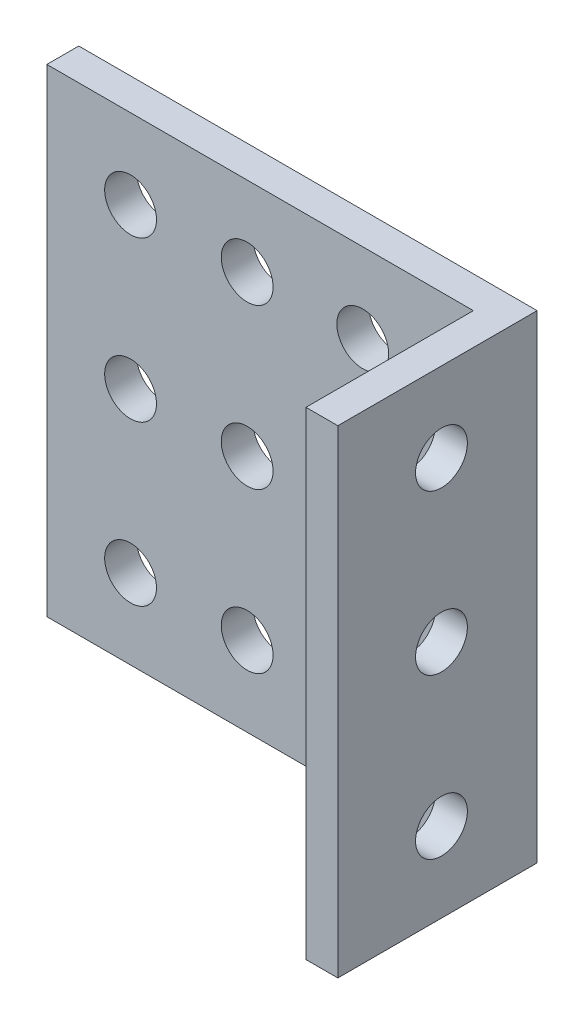
ISO-10303-21;
HEADER;
FILE_DESCRIPTION(('STEP AP214'),'2;1');
FILE_NAME('part.step','',(''),(''),'','','');
FILE_SCHEMA(('AUTOMOTIVE_DESIGN { 1 0 10303 214 1 1 1 1 }'));
ENDSEC;
DATA;
#1=APPLICATION_CONTEXT('core data for automotive mechanical design processes');
#2=APPLICATION_PROTOCOL_DEFINITION('international standard','automotive_design',2000,#1);
#3=PRODUCT_CONTEXT('',#1,'mechanical');
#4=PRODUCT('Part','Part','',(#3));
#5=PRODUCT_RELATED_PRODUCT_CATEGORY('part','',(#4));
#6=PRODUCT_DEFINITION_FORMATION('','',#4);
#7=PRODUCT_DEFINITION_CONTEXT('part definition',#1,'design');
#8=PRODUCT_DEFINITION('design','',#6,#7);
#9=PRODUCT_DEFINITION_SHAPE('','',#8);
#10=(LENGTH_UNIT() NAMED_UNIT(*) SI_UNIT(.MILLI.,.METRE.));
#11=(NAMED_UNIT(*) PLANE_ANGLE_UNIT() SI_UNIT($,.RADIAN.));
#12=(NAMED_UNIT(*) SI_UNIT($,.STERADIAN.) SOLID_ANGLE_UNIT());
#13=UNCERTAINTY_MEASURE_WITH_UNIT(LENGTH_MEASURE(1.E-05),#10,'distance_accuracy_value','');
#14=(GEOMETRIC_REPRESENTATION_CONTEXT(3) GLOBAL_UNCERTAINTY_ASSIGNED_CONTEXT((#13)) GLOBAL_UNIT_ASSIGNED_CONTEXT((#10,
#11,#12)) REPRESENTATION_CONTEXT('',''));
#15=CARTESIAN_POINT('',(0.,0.,0.));
#16=DIRECTION('',(0.,0.,1.));
#17=DIRECTION('',(1.,0.,0.));
#18=AXIS2_PLACEMENT_3D('',#15,#16,#17);
#19=CARTESIAN_POINT('',(-115.,-120.,16.));
#20=DIRECTION('',(1.,0.,0.));
#21=DIRECTION('',(0.,0.,-1.));
#22=AXIS2_PLACEMENT_3D('',#19,#20,#21);
#23=PLANE('',#22);
#24=DIRECTION('',(0.,-1.,0.));
#25=VECTOR('',#24,1.);
#26=CARTESIAN_POINT('',(-115.,-120.,0.));
#27=LINE('',#26,#25);
#28=CARTESIAN_POINT('',(-115.,120.,0.));
#29=VERTEX_POINT('',#28);
#30=CARTESIAN_POINT('',(-115.,-120.,0.));
#31=VERTEX_POINT('',#30);
#32=EDGE_CURVE('E93',#29,#31,#27,.T.);
#33=ORIENTED_EDGE('',*,*,#32,.T.);
#34=DIRECTION('',(0.,0.,-1.));
#35=VECTOR('',#34,1.);
#36=CARTESIAN_POINT('',(-115.,-120.,16.));
#37=LINE('',#36,#35);
#38=CARTESIAN_POINT('',(-115.,-120.,16.));
#39=VERTEX_POINT('',#38);
#40=EDGE_CURVE('E114',#39,#31,#37,.T.);
#41=ORIENTED_EDGE('',*,*,#40,.F.);
#42=DIRECTION('',(0.,-1.,0.));
#43=VECTOR('',#42,1.);
#44=CARTESIAN_POINT('',(-115.,-120.,16.));
#45=LINE('',#44,#43);
#46=CARTESIAN_POINT('',(-115.,120.,16.));
#47=VERTEX_POINT('',#46);
#48=EDGE_CURVE('E87',#47,#39,#45,.T.);
#49=ORIENTED_EDGE('',*,*,#48,.F.);
#50=DIRECTION('',(0.,0.,-1.));
#51=VECTOR('',#50,1.);
#52=CARTESIAN_POINT('',(-115.,120.,16.));
#53=LINE('',#52,#51);
#54=EDGE_CURVE('E79',#47,#29,#53,.T.);
#55=ORIENTED_EDGE('',*,*,#54,.T.);
#56=EDGE_LOOP('',(#33,#41,#49,#55));
#57=FACE_BOUND('',#56,.T.);
#58=ADVANCED_FACE('F36',(#57),#23,.F.);
#59=CARTESIAN_POINT('',(115.,-120.,16.));
#60=DIRECTION('',(0.,1.,0.));
#61=DIRECTION('',(-1.,0.,0.));
#62=AXIS2_PLACEMENT_3D('',#59,#60,#61);
#63=PLANE('',#62);
#64=DIRECTION('',(1.,0.,0.));
#65=VECTOR('',#64,1.);
#66=CARTESIAN_POINT('',(115.,-120.,0.));
#67=LINE('',#66,#65);
#68=CARTESIAN_POINT('',(115.,-120.,0.));
#69=VERTEX_POINT('',#68);
#70=EDGE_CURVE('E97',#31,#69,#67,.T.);
#71=ORIENTED_EDGE('',*,*,#70,.T.);
#72=DIRECTION('',(0.,0.,-1.));
#73=VECTOR('',#72,1.);
#74=CARTESIAN_POINT('',(115.,-120.,16.));
#75=LINE('',#74,#73);
#76=CARTESIAN_POINT('',(115.,-120.,100.));
#77=VERTEX_POINT('',#76);
#78=EDGE_CURVE('E111',#77,#69,#75,.T.);
#79=ORIENTED_EDGE('',*,*,#78,.F.);
#80=DIRECTION('',(1.,0.,0.));
#81=VECTOR('',#80,1.);
#82=CARTESIAN_POINT('',(115.,-120.,100.));
#83=LINE('',#82,#81);
#84=CARTESIAN_POINT('',(99.,-120.,100.));
#85=VERTEX_POINT('',#84);
#86=EDGE_CURVE('E175',#85,#77,#83,.T.);
#87=ORIENTED_EDGE('',*,*,#86,.F.);
#88=DIRECTION('',(0.,0.,-1.));
#89=VECTOR('',#88,1.);
#90=CARTESIAN_POINT('',(99.,-120.,100.));
#91=LINE('',#90,#89);
#92=CARTESIAN_POINT('',(99.,-120.,16.));
#93=VERTEX_POINT('',#92);
#94=EDGE_CURVE('E180',#85,#93,#91,.T.);
#95=ORIENTED_EDGE('',*,*,#94,.T.);
#96=DIRECTION('',(1.,0.,0.));
#97=VECTOR('',#96,1.);
#98=CARTESIAN_POINT('',(115.,-120.,16.));
#99=LINE('',#98,#97);
#100=EDGE_CURVE('E134',#39,#93,#99,.T.);
#101=ORIENTED_EDGE('',*,*,#100,.F.);
#102=ORIENTED_EDGE('',*,*,#40,.T.);
#103=EDGE_LOOP('',(#71,#79,#87,#95,#101,#102));
#104=FACE_BOUND('',#103,.T.);
#105=ADVANCED_FACE('F217',(#104),#63,.F.);
#106=CARTESIAN_POINT('',(115.,-120.,16.));
#107=DIRECTION('',(-1.,0.,0.));
#108=DIRECTION('',(0.,0.,1.));
#109=AXIS2_PLACEMENT_3D('',#106,#107,#108);
#110=PLANE('',#109);
#111=CARTESIAN_POINT('',(115.,0.,48.));
#112=DIRECTION('',(-1.,0.,0.));
#113=DIRECTION('',(0.,0.,1.));
#114=AXIS2_PLACEMENT_3D('',#111,#112,#113);
#115=CIRCLE('',#114,13.);
#116=CARTESIAN_POINT('',(115.,0.,61.));
#117=VERTEX_POINT('',#116);
#118=EDGE_CURVE('E270',#117,#117,#115,.T.);
#119=ORIENTED_EDGE('',*,*,#118,.T.);
#120=EDGE_LOOP('',(#119));
#121=FACE_BOUND('',#120,.T.);
#122=CARTESIAN_POINT('',(115.,80.,48.));
#123=DIRECTION('',(-1.,0.,0.));
#124=DIRECTION('',(0.,0.,1.));
#125=AXIS2_PLACEMENT_3D('',#122,#123,#124);
#126=CIRCLE('',#125,13.);
#127=CARTESIAN_POINT('',(115.,80.,61.));
#128=VERTEX_POINT('',#127);
#129=EDGE_CURVE('E179',#128,#128,#126,.T.);
#130=ORIENTED_EDGE('',*,*,#129,.T.);
#131=EDGE_LOOP('',(#130));
#132=FACE_BOUND('',#131,.T.);
#133=DIRECTION('',(0.,1.,0.));
#134=VECTOR('',#133,1.);
#135=CARTESIAN_POINT('',(115.,-120.,0.));
#136=LINE('',#135,#134);
#137=CARTESIAN_POINT('',(115.,120.,0.));
#138=VERTEX_POINT('',#137);
#139=EDGE_CURVE('E88',#69,#138,#136,.T.);
#140=ORIENTED_EDGE('',*,*,#139,.T.);
#141=DIRECTION('',(0.,0.,-1.));
#142=VECTOR('',#141,1.);
#143=CARTESIAN_POINT('',(115.,120.,16.));
#144=LINE('',#143,#142);
#145=CARTESIAN_POINT('',(115.,120.,100.));
#146=VERTEX_POINT('',#145);
#147=EDGE_CURVE('E83',#146,#138,#144,.T.);
#148=ORIENTED_EDGE('',*,*,#147,.F.);
#149=DIRECTION('',(0.,1.,0.));
#150=VECTOR('',#149,1.);
#151=CARTESIAN_POINT('',(115.,-120.,100.));
#152=LINE('',#151,#150);
#153=EDGE_CURVE('E178',#77,#146,#152,.T.);
#154=ORIENTED_EDGE('',*,*,#153,.F.);
#155=ORIENTED_EDGE('',*,*,#78,.T.);
#156=EDGE_LOOP('',(#140,#148,#154,#155));
#157=FACE_BOUND('',#156,.T.);
#158=CARTESIAN_POINT('',(115.,-80.,48.));
#159=DIRECTION('',(-1.,0.,0.));
#160=DIRECTION('',(0.,0.,1.));
#161=AXIS2_PLACEMENT_3D('',#158,#159,#160);
#162=CIRCLE('',#161,13.);
#163=CARTESIAN_POINT('',(115.,-80.,61.));
#164=VERTEX_POINT('',#163);
#165=EDGE_CURVE('E44',#164,#164,#162,.T.);
#166=ORIENTED_EDGE('',*,*,#165,.T.);
#167=EDGE_LOOP('',(#166));
#168=FACE_BOUND('',#167,.T.);
#169=ADVANCED_FACE('F191',(#121,#132,#157,#168),#110,.F.);
#170=CARTESIAN_POINT('',(115.,120.,16.));
#171=DIRECTION('',(0.,-1.,0.));
#172=DIRECTION('',(1.,0.,0.));
#173=AXIS2_PLACEMENT_3D('',#170,#171,#172);
#174=PLANE('',#173);
#175=DIRECTION('',(-1.,0.,0.));
#176=VECTOR('',#175,1.);
#177=CARTESIAN_POINT('',(115.,120.,0.));
#178=LINE('',#177,#176);
#179=EDGE_CURVE('E76',#138,#29,#178,.T.);
#180=ORIENTED_EDGE('',*,*,#179,.T.);
#181=ORIENTED_EDGE('',*,*,#54,.F.);
#182=DIRECTION('',(-1.,0.,0.));
#183=VECTOR('',#182,1.);
#184=CARTESIAN_POINT('',(115.,120.,16.));
#185=LINE('',#184,#183);
#186=CARTESIAN_POINT('',(99.,120.,16.));
#187=VERTEX_POINT('',#186);
#188=EDGE_CURVE('E56',#187,#47,#185,.T.);
#189=ORIENTED_EDGE('',*,*,#188,.F.);
#190=DIRECTION('',(0.,0.,-1.));
#191=VECTOR('',#190,1.);
#192=CARTESIAN_POINT('',(99.,120.,100.));
#193=LINE('',#192,#191);
#194=CARTESIAN_POINT('',(99.,120.,100.));
#195=VERTEX_POINT('',#194);
#196=EDGE_CURVE('E172',#195,#187,#193,.T.);
#197=ORIENTED_EDGE('',*,*,#196,.F.);
#198=DIRECTION('',(-1.,0.,0.));
#199=VECTOR('',#198,1.);
#200=CARTESIAN_POINT('',(115.,120.,100.));
#201=LINE('',#200,#199);
#202=EDGE_CURVE('E287',#146,#195,#201,.T.);
#203=ORIENTED_EDGE('',*,*,#202,.F.);
#204=ORIENTED_EDGE('',*,*,#147,.T.);
#205=EDGE_LOOP('',(#180,#181,#189,#197,#203,#204));
#206=FACE_BOUND('',#205,.T.);
#207=ADVANCED_FACE('F78',(#206),#174,.F.);
#208=CARTESIAN_POINT('',(-115.,120.,16.));
#209=DIRECTION('',(0.,0.,1.));
#210=DIRECTION('',(1.,0.,0.));
#211=AXIS2_PLACEMENT_3D('',#208,#209,#210);
#212=PLANE('',#211);
#213=DIRECTION('',(0.,-1.,0.));
#214=VECTOR('',#213,1.);
#215=CARTESIAN_POINT('',(99.,-120.,16.));
#216=LINE('',#215,#214);
#217=EDGE_CURVE('E51',#187,#93,#216,.T.);
#218=ORIENTED_EDGE('',*,*,#217,.F.);
#219=ORIENTED_EDGE('',*,*,#188,.T.);
#220=ORIENTED_EDGE('',*,*,#48,.T.);
#221=ORIENTED_EDGE('',*,*,#100,.T.);
#222=EDGE_LOOP('',(#218,#219,#220,#221));
#223=FACE_BOUND('',#222,.T.);
#224=CARTESIAN_POINT('',(-14.5,0.,16.));
#225=DIRECTION('',(0.,0.,1.));
#226=DIRECTION('',(1.,0.,0.));
#227=AXIS2_PLACEMENT_3D('',#224,#225,#226);
#228=CIRCLE('',#227,13.);
#229=CARTESIAN_POINT('',(-1.50000000000001,0.,16.));
#230=VERTEX_POINT('',#229);
#231=EDGE_CURVE('E166',#230,#230,#228,.T.);
#232=ORIENTED_EDGE('',*,*,#231,.F.);
#233=EDGE_LOOP('',(#232));
#234=FACE_BOUND('',#233,.T.);
#235=CARTESIAN_POINT('',(-73.,0.,16.));
#236=DIRECTION('',(0.,0.,1.));
#237=DIRECTION('',(1.,0.,0.));
#238=AXIS2_PLACEMENT_3D('',#235,#236,#237);
#239=CIRCLE('',#238,13.);
#240=CARTESIAN_POINT('',(-60.,0.,16.));
#241=VERTEX_POINT('',#240);
#242=EDGE_CURVE('E160',#241,#241,#239,.T.);
#243=ORIENTED_EDGE('',*,*,#242,.F.);
#244=EDGE_LOOP('',(#243));
#245=FACE_BOUND('',#244,.T.);
#246=CARTESIAN_POINT('',(43.5,0.,16.));
#247=DIRECTION('',(0.,0.,1.));
#248=DIRECTION('',(1.,0.,0.));
#249=AXIS2_PLACEMENT_3D('',#246,#247,#248);
#250=CIRCLE('',#249,13.);
#251=CARTESIAN_POINT('',(56.5,0.,16.));
#252=VERTEX_POINT('',#251);
#253=EDGE_CURVE('E152',#252,#252,#250,.T.);
#254=ORIENTED_EDGE('',*,*,#253,.F.);
#255=EDGE_LOOP('',(#254));
#256=FACE_BOUND('',#255,.T.);
#257=CARTESIAN_POINT('',(43.5,80.,16.));
#258=DIRECTION('',(0.,0.,1.));
#259=DIRECTION('',(1.,0.,0.));
#260=AXIS2_PLACEMENT_3D('',#257,#258,#259);
#261=CIRCLE('',#260,13.);
#262=CARTESIAN_POINT('',(56.5,80.,16.));
#263=VERTEX_POINT('',#262);
#264=EDGE_CURVE('E149',#263,#263,#261,.T.);
#265=ORIENTED_EDGE('',*,*,#264,.F.);
#266=EDGE_LOOP('',(#265));
#267=FACE_BOUND('',#266,.T.);
#268=CARTESIAN_POINT('',(-14.5,80.,16.));
#269=DIRECTION('',(0.,0.,1.));
#270=DIRECTION('',(1.,0.,0.));
#271=AXIS2_PLACEMENT_3D('',#268,#269,#270);
#272=CIRCLE('',#271,13.);
#273=CARTESIAN_POINT('',(-1.50000000000001,80.,16.));
#274=VERTEX_POINT('',#273);
#275=EDGE_CURVE('E143',#274,#274,#272,.T.);
#276=ORIENTED_EDGE('',*,*,#275,.F.);
#277=EDGE_LOOP('',(#276));
#278=FACE_BOUND('',#277,.T.);
#279=CARTESIAN_POINT('',(-73.,80.,16.));
#280=DIRECTION('',(0.,0.,1.));
#281=DIRECTION('',(1.,0.,0.));
#282=AXIS2_PLACEMENT_3D('',#279,#280,#281);
#283=CIRCLE('',#282,13.);
#284=CARTESIAN_POINT('',(-60.,80.,16.));
#285=VERTEX_POINT('',#284);
#286=EDGE_CURVE('E103',#285,#285,#283,.T.);
#287=ORIENTED_EDGE('',*,*,#286,.F.);
#288=EDGE_LOOP('',(#287));
#289=FACE_BOUND('',#288,.T.);
#290=CARTESIAN_POINT('',(43.5,-80.,16.));
#291=DIRECTION('',(0.,0.,1.));
#292=DIRECTION('',(1.,0.,0.));
#293=AXIS2_PLACEMENT_3D('',#290,#291,#292);
#294=CIRCLE('',#293,13.);
#295=CARTESIAN_POINT('',(56.5,-80.,16.));
#296=VERTEX_POINT('',#295);
#297=EDGE_CURVE('E119',#296,#296,#294,.T.);
#298=ORIENTED_EDGE('',*,*,#297,.F.);
#299=EDGE_LOOP('',(#298));
#300=FACE_BOUND('',#299,.T.);
#301=CARTESIAN_POINT('',(-73.,-80.,16.));
#302=DIRECTION('',(0.,0.,1.));
#303=DIRECTION('',(1.,0.,0.));
#304=AXIS2_PLACEMENT_3D('',#301,#302,#303);
#305=CIRCLE('',#304,13.);
#306=CARTESIAN_POINT('',(-60.,-80.,16.));
#307=VERTEX_POINT('',#306);
#308=EDGE_CURVE('E125',#307,#307,#305,.T.);
#309=ORIENTED_EDGE('',*,*,#308,.F.);
#310=EDGE_LOOP('',(#309));
#311=FACE_BOUND('',#310,.T.);
#312=CARTESIAN_POINT('',(-14.5,-80.,16.));
#313=DIRECTION('',(0.,0.,1.));
#314=DIRECTION('',(1.,0.,0.));
#315=AXIS2_PLACEMENT_3D('',#312,#313,#314);
#316=CIRCLE('',#315,13.);
#317=CARTESIAN_POINT('',(-1.50000000000001,-80.,16.));
#318=VERTEX_POINT('',#317);
#319=EDGE_CURVE('E131',#318,#318,#316,.T.);
#320=ORIENTED_EDGE('',*,*,#319,.F.);
#321=EDGE_LOOP('',(#320));
#322=FACE_BOUND('',#321,.T.);
#323=ADVANCED_FACE('F246',(#223,#234,#245,#256,#267,#278,#289,#300,#311,#322),#212,.T.);
#324=CARTESIAN_POINT('',(-115.,120.,0.));
#325=DIRECTION('',(0.,0.,1.));
#326=DIRECTION('',(1.,0.,0.));
#327=AXIS2_PLACEMENT_3D('',#324,#325,#326);
#328=PLANE('',#327);
#329=CARTESIAN_POINT('',(-14.5,0.,0.));
#330=DIRECTION('',(0.,0.,1.));
#331=DIRECTION('',(1.,0.,0.));
#332=AXIS2_PLACEMENT_3D('',#329,#330,#331);
#333=CIRCLE('',#332,13.);
#334=CARTESIAN_POINT('',(-1.50000000000001,0.,0.));
#335=VERTEX_POINT('',#334);
#336=EDGE_CURVE('E169',#335,#335,#333,.T.);
#337=ORIENTED_EDGE('',*,*,#336,.T.);
#338=EDGE_LOOP('',(#337));
#339=FACE_BOUND('',#338,.T.);
#340=CARTESIAN_POINT('',(-73.,0.,0.));
#341=DIRECTION('',(0.,0.,1.));
#342=DIRECTION('',(1.,0.,0.));
#343=AXIS2_PLACEMENT_3D('',#340,#341,#342);
#344=CIRCLE('',#343,13.);
#345=CARTESIAN_POINT('',(-60.,0.,0.));
#346=VERTEX_POINT('',#345);
#347=EDGE_CURVE('E163',#346,#346,#344,.T.);
#348=ORIENTED_EDGE('',*,*,#347,.T.);
#349=EDGE_LOOP('',(#348));
#350=FACE_BOUND('',#349,.T.);
#351=CARTESIAN_POINT('',(43.5,0.,0.));
#352=DIRECTION('',(0.,0.,1.));
#353=DIRECTION('',(1.,0.,0.));
#354=AXIS2_PLACEMENT_3D('',#351,#352,#353);
#355=CIRCLE('',#354,13.);
#356=CARTESIAN_POINT('',(56.5,0.,0.));
#357=VERTEX_POINT('',#356);
#358=EDGE_CURVE('E157',#357,#357,#355,.T.);
#359=ORIENTED_EDGE('',*,*,#358,.T.);
#360=EDGE_LOOP('',(#359));
#361=FACE_BOUND('',#360,.T.);
#362=CARTESIAN_POINT('',(43.5,80.,0.));
#363=DIRECTION('',(0.,0.,1.));
#364=DIRECTION('',(1.,0.,0.));
#365=AXIS2_PLACEMENT_3D('',#362,#363,#364);
#366=CIRCLE('',#365,13.);
#367=CARTESIAN_POINT('',(56.5,80.,0.));
#368=VERTEX_POINT('',#367);
#369=EDGE_CURVE('E146',#368,#368,#366,.T.);
#370=ORIENTED_EDGE('',*,*,#369,.T.);
#371=EDGE_LOOP('',(#370));
#372=FACE_BOUND('',#371,.T.);
#373=CARTESIAN_POINT('',(-14.5,80.,0.));
#374=DIRECTION('',(0.,0.,1.));
#375=DIRECTION('',(1.,0.,0.));
#376=AXIS2_PLACEMENT_3D('',#373,#374,#375);
#377=CIRCLE('',#376,13.);
#378=CARTESIAN_POINT('',(-1.50000000000001,80.,0.));
#379=VERTEX_POINT('',#378);
#380=EDGE_CURVE('E141',#379,#379,#377,.T.);
#381=ORIENTED_EDGE('',*,*,#380,.T.);
#382=EDGE_LOOP('',(#381));
#383=FACE_BOUND('',#382,.T.);
#384=CARTESIAN_POINT('',(-73.,80.,0.));
#385=DIRECTION('',(0.,0.,1.));
#386=DIRECTION('',(1.,0.,0.));
#387=AXIS2_PLACEMENT_3D('',#384,#385,#386);
#388=CIRCLE('',#387,13.);
#389=CARTESIAN_POINT('',(-60.,80.,0.));
#390=VERTEX_POINT('',#389);
#391=EDGE_CURVE('E99',#390,#390,#388,.T.);
#392=ORIENTED_EDGE('',*,*,#391,.T.);
#393=EDGE_LOOP('',(#392));
#394=FACE_BOUND('',#393,.T.);
#395=ORIENTED_EDGE('',*,*,#32,.F.);
#396=ORIENTED_EDGE('',*,*,#179,.F.);
#397=ORIENTED_EDGE('',*,*,#139,.F.);
#398=ORIENTED_EDGE('',*,*,#70,.F.);
#399=EDGE_LOOP('',(#395,#396,#397,#398));
#400=FACE_BOUND('',#399,.T.);
#401=CARTESIAN_POINT('',(43.5,-80.,0.));
#402=DIRECTION('',(0.,0.,1.));
#403=DIRECTION('',(1.,0.,0.));
#404=AXIS2_PLACEMENT_3D('',#401,#402,#403);
#405=CIRCLE('',#404,13.);
#406=CARTESIAN_POINT('',(56.5,-80.,0.));
#407=VERTEX_POINT('',#406);
#408=EDGE_CURVE('E116',#407,#407,#405,.T.);
#409=ORIENTED_EDGE('',*,*,#408,.T.);
#410=EDGE_LOOP('',(#409));
#411=FACE_BOUND('',#410,.T.);
#412=CARTESIAN_POINT('',(-73.,-80.,0.));
#413=DIRECTION('',(0.,0.,1.));
#414=DIRECTION('',(1.,0.,0.));
#415=AXIS2_PLACEMENT_3D('',#412,#413,#414);
#416=CIRCLE('',#415,13.);
#417=CARTESIAN_POINT('',(-60.,-80.,0.));
#418=VERTEX_POINT('',#417);
#419=EDGE_CURVE('E122',#418,#418,#416,.T.);
#420=ORIENTED_EDGE('',*,*,#419,.T.);
#421=EDGE_LOOP('',(#420));
#422=FACE_BOUND('',#421,.T.);
#423=CARTESIAN_POINT('',(-14.5,-80.,0.));
#424=DIRECTION('',(0.,0.,1.));
#425=DIRECTION('',(1.,0.,0.));
#426=AXIS2_PLACEMENT_3D('',#423,#424,#425);
#427=CIRCLE('',#426,13.);
#428=CARTESIAN_POINT('',(-1.50000000000001,-80.,0.));
#429=VERTEX_POINT('',#428);
#430=EDGE_CURVE('E128',#429,#429,#427,.T.);
#431=ORIENTED_EDGE('',*,*,#430,.T.);
#432=EDGE_LOOP('',(#431));
#433=FACE_BOUND('',#432,.T.);
#434=ADVANCED_FACE('F95',(#339,#350,#361,#372,#383,#394,#400,#411,#422,#433),#328,.F.);
#435=CARTESIAN_POINT('',(-73.,80.,0.));
#436=DIRECTION('',(0.,0.,1.));
#437=DIRECTION('',(1.,0.,0.));
#438=AXIS2_PLACEMENT_3D('',#435,#436,#437);
#439=CYLINDRICAL_SURFACE('',#438,13.);
#440=ORIENTED_EDGE('',*,*,#391,.F.);
#441=EDGE_LOOP('',(#440));
#442=FACE_BOUND('',#441,.T.);
#443=ORIENTED_EDGE('',*,*,#286,.T.);
#444=EDGE_LOOP('',(#443));
#445=FACE_BOUND('',#444,.T.);
#446=ADVANCED_FACE('F256',(#442,#445),#439,.F.);
#447=CARTESIAN_POINT('',(-14.5,80.,0.));
#448=DIRECTION('',(0.,0.,1.));
#449=DIRECTION('',(1.,0.,0.));
#450=AXIS2_PLACEMENT_3D('',#447,#448,#449);
#451=CYLINDRICAL_SURFACE('',#450,13.);
#452=ORIENTED_EDGE('',*,*,#380,.F.);
#453=EDGE_LOOP('',(#452));
#454=FACE_BOUND('',#453,.T.);
#455=ORIENTED_EDGE('',*,*,#275,.T.);
#456=EDGE_LOOP('',(#455));
#457=FACE_BOUND('',#456,.T.);
#458=ADVANCED_FACE('F401',(#454,#457),#451,.F.);
#459=CARTESIAN_POINT('',(43.5,80.,0.));
#460=DIRECTION('',(0.,0.,1.));
#461=DIRECTION('',(1.,0.,0.));
#462=AXIS2_PLACEMENT_3D('',#459,#460,#461);
#463=CYLINDRICAL_SURFACE('',#462,13.);
#464=ORIENTED_EDGE('',*,*,#369,.F.);
#465=EDGE_LOOP('',(#464));
#466=FACE_BOUND('',#465,.T.);
#467=ORIENTED_EDGE('',*,*,#264,.T.);
#468=EDGE_LOOP('',(#467));
#469=FACE_BOUND('',#468,.T.);
#470=ADVANCED_FACE('F385',(#466,#469),#463,.F.);
#471=CARTESIAN_POINT('',(43.5,0.,0.));
#472=DIRECTION('',(0.,0.,1.));
#473=DIRECTION('',(1.,0.,0.));
#474=AXIS2_PLACEMENT_3D('',#471,#472,#473);
#475=CYLINDRICAL_SURFACE('',#474,13.);
#476=ORIENTED_EDGE('',*,*,#358,.F.);
#477=EDGE_LOOP('',(#476));
#478=FACE_BOUND('',#477,.T.);
#479=ORIENTED_EDGE('',*,*,#253,.T.);
#480=EDGE_LOOP('',(#479));
#481=FACE_BOUND('',#480,.T.);
#482=ADVANCED_FACE('F230',(#478,#481),#475,.F.);
#483=CARTESIAN_POINT('',(43.5,-80.,0.));
#484=DIRECTION('',(0.,0.,1.));
#485=DIRECTION('',(1.,0.,0.));
#486=AXIS2_PLACEMENT_3D('',#483,#484,#485);
#487=CYLINDRICAL_SURFACE('',#486,13.);
#488=ORIENTED_EDGE('',*,*,#408,.F.);
#489=EDGE_LOOP('',(#488));
#490=FACE_BOUND('',#489,.T.);
#491=ORIENTED_EDGE('',*,*,#297,.T.);
#492=EDGE_LOOP('',(#491));
#493=FACE_BOUND('',#492,.T.);
#494=ADVANCED_FACE('F226',(#490,#493),#487,.F.);
#495=CARTESIAN_POINT('',(-73.,0.,0.));
#496=DIRECTION('',(0.,0.,1.));
#497=DIRECTION('',(1.,0.,0.));
#498=AXIS2_PLACEMENT_3D('',#495,#496,#497);
#499=CYLINDRICAL_SURFACE('',#498,13.);
#500=ORIENTED_EDGE('',*,*,#347,.F.);
#501=EDGE_LOOP('',(#500));
#502=FACE_BOUND('',#501,.T.);
#503=ORIENTED_EDGE('',*,*,#242,.T.);
#504=EDGE_LOOP('',(#503));
#505=FACE_BOUND('',#504,.T.);
#506=ADVANCED_FACE('F229',(#502,#505),#499,.F.);
#507=CARTESIAN_POINT('',(-73.,-80.,0.));
#508=DIRECTION('',(0.,0.,1.));
#509=DIRECTION('',(1.,0.,0.));
#510=AXIS2_PLACEMENT_3D('',#507,#508,#509);
#511=CYLINDRICAL_SURFACE('',#510,13.);
#512=ORIENTED_EDGE('',*,*,#419,.F.);
#513=EDGE_LOOP('',(#512));
#514=FACE_BOUND('',#513,.T.);
#515=ORIENTED_EDGE('',*,*,#308,.T.);
#516=EDGE_LOOP('',(#515));
#517=FACE_BOUND('',#516,.T.);
#518=ADVANCED_FACE('F232',(#514,#517),#511,.F.);
#519=CARTESIAN_POINT('',(-14.5,0.,0.));
#520=DIRECTION('',(0.,0.,1.));
#521=DIRECTION('',(1.,0.,0.));
#522=AXIS2_PLACEMENT_3D('',#519,#520,#521);
#523=CYLINDRICAL_SURFACE('',#522,13.);
#524=ORIENTED_EDGE('',*,*,#336,.F.);
#525=EDGE_LOOP('',(#524));
#526=FACE_BOUND('',#525,.T.);
#527=ORIENTED_EDGE('',*,*,#231,.T.);
#528=EDGE_LOOP('',(#527));
#529=FACE_BOUND('',#528,.T.);
#530=ADVANCED_FACE('F211',(#526,#529),#523,.F.);
#531=CARTESIAN_POINT('',(-14.5,-80.,0.));
#532=DIRECTION('',(0.,0.,1.));
#533=DIRECTION('',(1.,0.,0.));
#534=AXIS2_PLACEMENT_3D('',#531,#532,#533);
#535=CYLINDRICAL_SURFACE('',#534,13.);
#536=ORIENTED_EDGE('',*,*,#430,.F.);
#537=EDGE_LOOP('',(#536));
#538=FACE_BOUND('',#537,.T.);
#539=ORIENTED_EDGE('',*,*,#319,.T.);
#540=EDGE_LOOP('',(#539));
#541=FACE_BOUND('',#540,.T.);
#542=ADVANCED_FACE('F201',(#538,#541),#535,.F.);
#543=CARTESIAN_POINT('',(99.,-120.,100.));
#544=DIRECTION('',(1.,0.,0.));
#545=DIRECTION('',(0.,0.,-1.));
#546=AXIS2_PLACEMENT_3D('',#543,#544,#545);
#547=PLANE('',#546);
#548=CARTESIAN_POINT('',(99.,0.,48.));
#549=DIRECTION('',(-1.,0.,0.));
#550=DIRECTION('',(0.,0.,1.));
#551=AXIS2_PLACEMENT_3D('',#548,#549,#550);
#552=CIRCLE('',#551,13.);
#553=CARTESIAN_POINT('',(99.,0.,61.));
#554=VERTEX_POINT('',#553);
#555=EDGE_CURVE('E294',#554,#554,#552,.T.);
#556=ORIENTED_EDGE('',*,*,#555,.F.);
#557=EDGE_LOOP('',(#556));
#558=FACE_BOUND('',#557,.T.);
#559=CARTESIAN_POINT('',(99.,80.,48.));
#560=DIRECTION('',(-1.,0.,0.));
#561=DIRECTION('',(0.,0.,1.));
#562=AXIS2_PLACEMENT_3D('',#559,#560,#561);
#563=CIRCLE('',#562,13.);
#564=CARTESIAN_POINT('',(99.,80.,61.));
#565=VERTEX_POINT('',#564);
#566=EDGE_CURVE('E291',#565,#565,#563,.T.);
#567=ORIENTED_EDGE('',*,*,#566,.F.);
#568=EDGE_LOOP('',(#567));
#569=FACE_BOUND('',#568,.T.);
#570=ORIENTED_EDGE('',*,*,#217,.T.);
#571=ORIENTED_EDGE('',*,*,#94,.F.);
#572=DIRECTION('',(0.,-1.,0.));
#573=VECTOR('',#572,1.);
#574=CARTESIAN_POINT('',(99.,-120.,100.));
#575=LINE('',#574,#573);
#576=EDGE_CURVE('E285',#195,#85,#575,.T.);
#577=ORIENTED_EDGE('',*,*,#576,.F.);
#578=ORIENTED_EDGE('',*,*,#196,.T.);
#579=EDGE_LOOP('',(#570,#571,#577,#578));
#580=FACE_BOUND('',#579,.T.);
#581=CARTESIAN_POINT('',(99.,-80.,48.));
#582=DIRECTION('',(-1.,0.,0.));
#583=DIRECTION('',(0.,0.,1.));
#584=AXIS2_PLACEMENT_3D('',#581,#582,#583);
#585=CIRCLE('',#584,13.);
#586=CARTESIAN_POINT('',(99.,-80.,61.));
#587=VERTEX_POINT('',#586);
#588=EDGE_CURVE('E11',#587,#587,#585,.T.);
#589=ORIENTED_EDGE('',*,*,#588,.F.);
#590=EDGE_LOOP('',(#589));
#591=FACE_BOUND('',#590,.T.);
#592=ADVANCED_FACE('F198',(#558,#569,#580,#591),#547,.F.);
#593=CARTESIAN_POINT('',(115.,120.,100.));
#594=DIRECTION('',(0.,0.,1.));
#595=DIRECTION('',(1.,0.,0.));
#596=AXIS2_PLACEMENT_3D('',#593,#594,#595);
#597=PLANE('',#596);
#598=ORIENTED_EDGE('',*,*,#153,.T.);
#599=ORIENTED_EDGE('',*,*,#202,.T.);
#600=ORIENTED_EDGE('',*,*,#576,.T.);
#601=ORIENTED_EDGE('',*,*,#86,.T.);
#602=EDGE_LOOP('',(#598,#599,#600,#601));
#603=FACE_BOUND('',#602,.T.);
#604=ADVANCED_FACE('F200',(#603),#597,.T.);
#605=CARTESIAN_POINT('',(115.,80.,48.));
#606=DIRECTION('',(-1.,0.,0.));
#607=DIRECTION('',(0.,0.,1.));
#608=AXIS2_PLACEMENT_3D('',#605,#606,#607);
#609=CYLINDRICAL_SURFACE('',#608,13.);
#610=ORIENTED_EDGE('',*,*,#129,.F.);
#611=EDGE_LOOP('',(#610));
#612=FACE_BOUND('',#611,.T.);
#613=ORIENTED_EDGE('',*,*,#566,.T.);
#614=EDGE_LOOP('',(#613));
#615=FACE_BOUND('',#614,.T.);
#616=ADVANCED_FACE('F208',(#612,#615),#609,.F.);
#617=CARTESIAN_POINT('',(115.,0.,48.));
#618=DIRECTION('',(-1.,0.,0.));
#619=DIRECTION('',(0.,0.,1.));
#620=AXIS2_PLACEMENT_3D('',#617,#618,#619);
#621=CYLINDRICAL_SURFACE('',#620,13.);
#622=ORIENTED_EDGE('',*,*,#118,.F.);
#623=EDGE_LOOP('',(#622));
#624=FACE_BOUND('',#623,.T.);
#625=ORIENTED_EDGE('',*,*,#555,.T.);
#626=EDGE_LOOP('',(#625));
#627=FACE_BOUND('',#626,.T.);
#628=ADVANCED_FACE('F195',(#624,#627),#621,.F.);
#629=CARTESIAN_POINT('',(115.,-80.,48.));
#630=DIRECTION('',(-1.,0.,0.));
#631=DIRECTION('',(0.,0.,1.));
#632=AXIS2_PLACEMENT_3D('',#629,#630,#631);
#633=CYLINDRICAL_SURFACE('',#632,13.);
#634=ORIENTED_EDGE('',*,*,#165,.F.);
#635=EDGE_LOOP('',(#634));
#636=FACE_BOUND('',#635,.T.);
#637=ORIENTED_EDGE('',*,*,#588,.T.);
#638=EDGE_LOOP('',(#637));
#639=FACE_BOUND('',#638,.T.);
#640=ADVANCED_FACE('F38',(#636,#639),#633,.F.);
#641=CLOSED_SHELL('',(#58,#105,#169,#207,#323,#434,#446,#458,#470,#482,#494,#506,#518,#530,#542,
#592,#604,#616,#628,#640));
#642=MANIFOLD_SOLID_BREP('B2',#641);
#643=ADVANCED_BREP_SHAPE_REPRESENTATION('',(#18,#642),#14);
#644=SHAPE_DEFINITION_REPRESENTATION(#9,#643);
ENDSEC;
END-ISO-10303-21;
